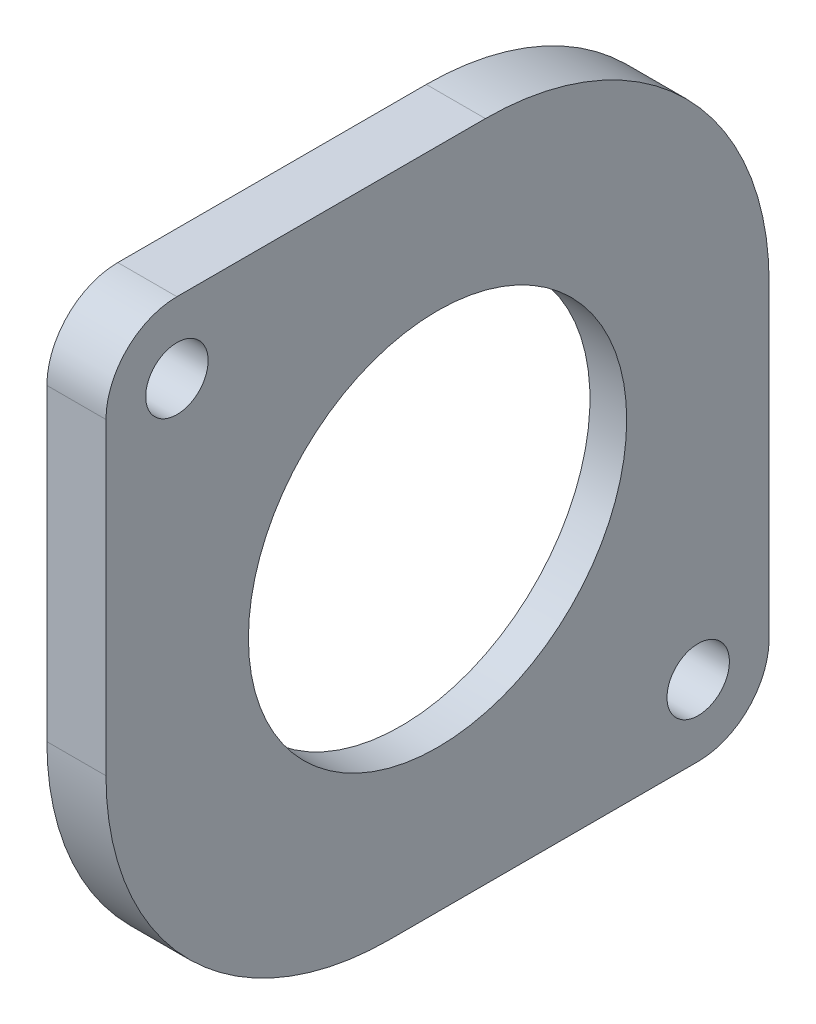
ISO-10303-21;
HEADER;
FILE_DESCRIPTION(('STEP AP214'),'2;1');
FILE_NAME('part.step','',(''),(''),'','','');
FILE_SCHEMA(('AUTOMOTIVE_DESIGN { 1 0 10303 214 1 1 1 1 }'));
ENDSEC;
DATA;
#1=APPLICATION_CONTEXT('core data for automotive mechanical design processes');
#2=APPLICATION_PROTOCOL_DEFINITION('international standard','automotive_design',2000,#1);
#3=PRODUCT_CONTEXT('',#1,'mechanical');
#4=PRODUCT('Part','Part','',(#3));
#5=PRODUCT_RELATED_PRODUCT_CATEGORY('part','',(#4));
#6=PRODUCT_DEFINITION_FORMATION('','',#4);
#7=PRODUCT_DEFINITION_CONTEXT('part definition',#1,'design');
#8=PRODUCT_DEFINITION('design','',#6,#7);
#9=PRODUCT_DEFINITION_SHAPE('','',#8);
#10=(LENGTH_UNIT() NAMED_UNIT(*) SI_UNIT(.MILLI.,.METRE.));
#11=(NAMED_UNIT(*) PLANE_ANGLE_UNIT() SI_UNIT($,.RADIAN.));
#12=(NAMED_UNIT(*) SI_UNIT($,.STERADIAN.) SOLID_ANGLE_UNIT());
#13=UNCERTAINTY_MEASURE_WITH_UNIT(LENGTH_MEASURE(1.E-05),#10,'distance_accuracy_value','');
#14=(GEOMETRIC_REPRESENTATION_CONTEXT(3) GLOBAL_UNCERTAINTY_ASSIGNED_CONTEXT((#13)) GLOBAL_UNIT_ASSIGNED_CONTEXT((#10,
#11,#12)) REPRESENTATION_CONTEXT('',''));
#15=CARTESIAN_POINT('',(0.,0.,0.));
#16=DIRECTION('',(0.,0.,1.));
#17=DIRECTION('',(1.,0.,0.));
#18=AXIS2_PLACEMENT_3D('',#15,#16,#17);
#19=CARTESIAN_POINT('',(3.96875,0.,0.));
#20=DIRECTION('',(-1.,0.,0.));
#21=DIRECTION('',(0.,0.,1.));
#22=AXIS2_PLACEMENT_3D('',#19,#20,#21);
#23=CYLINDRICAL_SURFACE('',#22,12.7);
#24=CARTESIAN_POINT('',(3.96875,0.,0.));
#25=DIRECTION('',(1.,0.,0.));
#26=DIRECTION('',(0.,0.,-1.));
#27=AXIS2_PLACEMENT_3D('',#24,#25,#26);
#28=CIRCLE('',#27,12.7);
#29=CARTESIAN_POINT('',(3.96875,0.,-12.7));
#30=VERTEX_POINT('',#29);
#31=EDGE_CURVE('E147',#30,#30,#28,.T.);
#32=ORIENTED_EDGE('',*,*,#31,.T.);
#33=EDGE_LOOP('',(#32));
#34=FACE_BOUND('',#33,.T.);
#35=CARTESIAN_POINT('',(1.50114,0.,0.));
#36=DIRECTION('',(-1.,0.,0.));
#37=DIRECTION('',(0.,0.,1.));
#38=AXIS2_PLACEMENT_3D('',#35,#36,#37);
#39=CIRCLE('',#38,12.7);
#40=CARTESIAN_POINT('',(1.50114,0.,12.7));
#41=VERTEX_POINT('',#40);
#42=EDGE_CURVE('E178',#41,#41,#39,.T.);
#43=ORIENTED_EDGE('',*,*,#42,.T.);
#44=EDGE_LOOP('',(#43));
#45=FACE_BOUND('',#44,.T.);
#46=ADVANCED_FACE('F39',(#34,#45),#23,.F.);
#47=CARTESIAN_POINT('',(3.96875,-17.5,-17.5));
#48=DIRECTION('',(1.,0.,0.));
#49=DIRECTION('',(0.,0.,-1.));
#50=AXIS2_PLACEMENT_3D('',#47,#48,#49);
#51=PLANE('',#50);
#52=CARTESIAN_POINT('',(3.96875,17.5,17.5));
#53=DIRECTION('',(1.,0.,0.));
#54=DIRECTION('',(0.,0.,-1.));
#55=AXIS2_PLACEMENT_3D('',#52,#53,#54);
#56=CIRCLE('',#55,2.09549999999999);
#57=CARTESIAN_POINT('',(3.96875,17.5,15.4045));
#58=VERTEX_POINT('',#57);
#59=EDGE_CURVE('E265',#58,#58,#56,.T.);
#60=ORIENTED_EDGE('',*,*,#59,.F.);
#61=EDGE_LOOP('',(#60));
#62=FACE_BOUND('',#61,.T.);
#63=CARTESIAN_POINT('',(3.96875,-17.5,-17.5));
#64=DIRECTION('',(1.,0.,0.));
#65=DIRECTION('',(0.,0.,-1.));
#66=AXIS2_PLACEMENT_3D('',#63,#64,#65);
#67=CIRCLE('',#66,2.09549999999999);
#68=CARTESIAN_POINT('',(3.96875,-17.5,-19.5955));
#69=VERTEX_POINT('',#68);
#70=EDGE_CURVE('E264',#69,#69,#67,.T.);
#71=ORIENTED_EDGE('',*,*,#70,.F.);
#72=EDGE_LOOP('',(#71));
#73=FACE_BOUND('',#72,.T.);
#74=CARTESIAN_POINT('',(3.96875,-17.5,-17.5));
#75=DIRECTION('',(1.,0.,0.));
#76=DIRECTION('',(0.,0.,-1.));
#77=AXIS2_PLACEMENT_3D('',#74,#75,#76);
#78=CIRCLE('',#77,4.76250000000001);
#79=CARTESIAN_POINT('',(3.96875,-22.2625,-17.5));
#80=VERTEX_POINT('',#79);
#81=CARTESIAN_POINT('',(3.96875,-17.5,-22.2625));
#82=VERTEX_POINT('',#81);
#83=EDGE_CURVE('E161',#80,#82,#78,.T.);
#84=ORIENTED_EDGE('',*,*,#83,.T.);
#85=DIRECTION('',(0.,1.,0.));
#86=VECTOR('',#85,1.);
#87=CARTESIAN_POINT('',(3.96875,3.21249999999987,-22.2625));
#88=LINE('',#87,#86);
#89=CARTESIAN_POINT('',(3.96875,3.21249999999987,-22.2625));
#90=VERTEX_POINT('',#89);
#91=EDGE_CURVE('E103',#82,#90,#88,.T.);
#92=ORIENTED_EDGE('',*,*,#91,.T.);
#93=CARTESIAN_POINT('',(3.96875,3.2125,-3.21250000000001));
#94=DIRECTION('',(1.,0.,0.));
#95=DIRECTION('',(0.,0.,1.));
#96=AXIS2_PLACEMENT_3D('',#93,#94,#95);
#97=CIRCLE('',#96,19.05);
#98=CARTESIAN_POINT('',(3.96875,22.2625,-3.21249999999987));
#99=VERTEX_POINT('',#98);
#100=EDGE_CURVE('E251',#90,#99,#97,.T.);
#101=ORIENTED_EDGE('',*,*,#100,.T.);
#102=DIRECTION('',(0.,0.,1.));
#103=VECTOR('',#102,1.);
#104=CARTESIAN_POINT('',(3.96875,22.2625,17.5));
#105=LINE('',#104,#103);
#106=CARTESIAN_POINT('',(3.96875,22.2625,17.5));
#107=VERTEX_POINT('',#106);
#108=EDGE_CURVE('E254',#99,#107,#105,.T.);
#109=ORIENTED_EDGE('',*,*,#108,.T.);
#110=CARTESIAN_POINT('',(3.96875,17.5,17.5));
#111=DIRECTION('',(1.,0.,0.));
#112=DIRECTION('',(0.,0.,-1.));
#113=AXIS2_PLACEMENT_3D('',#110,#111,#112);
#114=CIRCLE('',#113,4.7625);
#115=CARTESIAN_POINT('',(3.96875,17.5,22.2625));
#116=VERTEX_POINT('',#115);
#117=EDGE_CURVE('E125',#107,#116,#114,.T.);
#118=ORIENTED_EDGE('',*,*,#117,.T.);
#119=DIRECTION('',(0.,-1.,0.));
#120=VECTOR('',#119,1.);
#121=CARTESIAN_POINT('',(3.96875,17.5,22.2625));
#122=LINE('',#121,#120);
#123=CARTESIAN_POINT('',(3.96875,-3.21249999999986,22.2625));
#124=VERTEX_POINT('',#123);
#125=EDGE_CURVE('E118',#116,#124,#122,.T.);
#126=ORIENTED_EDGE('',*,*,#125,.T.);
#127=CARTESIAN_POINT('',(3.96875,-3.2125,3.2125));
#128=DIRECTION('',(1.,0.,0.));
#129=DIRECTION('',(0.,0.,-1.));
#130=AXIS2_PLACEMENT_3D('',#127,#128,#129);
#131=CIRCLE('',#130,19.05);
#132=CARTESIAN_POINT('',(3.96875,-22.2625,3.21249999999987));
#133=VERTEX_POINT('',#132);
#134=EDGE_CURVE('E123',#124,#133,#131,.T.);
#135=ORIENTED_EDGE('',*,*,#134,.T.);
#136=DIRECTION('',(0.,0.,-1.));
#137=VECTOR('',#136,1.);
#138=CARTESIAN_POINT('',(3.96875,-22.2625,3.21249999999986));
#139=LINE('',#138,#137);
#140=EDGE_CURVE('E57',#133,#80,#139,.T.);
#141=ORIENTED_EDGE('',*,*,#140,.T.);
#142=EDGE_LOOP('',(#84,#92,#101,#109,#118,#126,#135,#141));
#143=FACE_BOUND('',#142,.T.);
#144=ORIENTED_EDGE('',*,*,#31,.F.);
#145=EDGE_LOOP('',(#144));
#146=FACE_BOUND('',#145,.T.);
#147=ADVANCED_FACE('F120',(#62,#73,#143,#146),#51,.T.);
#148=CARTESIAN_POINT('',(0.,-17.5,-17.5));
#149=DIRECTION('',(1.,0.,0.));
#150=DIRECTION('',(0.,0.,-1.));
#151=AXIS2_PLACEMENT_3D('',#148,#149,#150);
#152=PLANE('',#151);
#153=CARTESIAN_POINT('',(0.,0.,0.));
#154=DIRECTION('',(1.,0.,0.));
#155=DIRECTION('',(0.,0.,-1.));
#156=AXIS2_PLACEMENT_3D('',#153,#154,#155);
#157=CIRCLE('',#156,20.394295);
#158=CARTESIAN_POINT('',(0.,0.,-20.394295));
#159=VERTEX_POINT('',#158);
#160=EDGE_CURVE('E11',#159,#159,#157,.T.);
#161=ORIENTED_EDGE('',*,*,#160,.T.);
#162=EDGE_LOOP('',(#161));
#163=FACE_BOUND('',#162,.T.);
#164=CARTESIAN_POINT('',(0.,17.5,17.5));
#165=DIRECTION('',(1.,0.,0.));
#166=DIRECTION('',(0.,0.,-1.));
#167=AXIS2_PLACEMENT_3D('',#164,#165,#166);
#168=CIRCLE('',#167,2.0955);
#169=CARTESIAN_POINT('',(0.,17.5,15.4045));
#170=VERTEX_POINT('',#169);
#171=EDGE_CURVE('E262',#170,#170,#168,.T.);
#172=ORIENTED_EDGE('',*,*,#171,.T.);
#173=EDGE_LOOP('',(#172));
#174=FACE_BOUND('',#173,.T.);
#175=CARTESIAN_POINT('',(0.,-17.5,-17.5));
#176=DIRECTION('',(1.,0.,0.));
#177=DIRECTION('',(0.,0.,-1.));
#178=AXIS2_PLACEMENT_3D('',#175,#176,#177);
#179=CIRCLE('',#178,2.0955);
#180=CARTESIAN_POINT('',(0.,-17.5,-19.5955));
#181=VERTEX_POINT('',#180);
#182=EDGE_CURVE('E270',#181,#181,#179,.T.);
#183=ORIENTED_EDGE('',*,*,#182,.T.);
#184=EDGE_LOOP('',(#183));
#185=FACE_BOUND('',#184,.T.);
#186=CARTESIAN_POINT('',(0.,-17.5,-17.5));
#187=DIRECTION('',(1.,0.,0.));
#188=DIRECTION('',(0.,0.,-1.));
#189=AXIS2_PLACEMENT_3D('',#186,#187,#188);
#190=CIRCLE('',#189,4.76250000000001);
#191=CARTESIAN_POINT('',(0.,-22.2625,-17.5));
#192=VERTEX_POINT('',#191);
#193=CARTESIAN_POINT('',(0.,-17.5,-22.2625));
#194=VERTEX_POINT('',#193);
#195=EDGE_CURVE('E143',#192,#194,#190,.T.);
#196=ORIENTED_EDGE('',*,*,#195,.F.);
#197=DIRECTION('',(0.,0.,-1.));
#198=VECTOR('',#197,1.);
#199=CARTESIAN_POINT('',(0.,-22.2625,3.21249999999986));
#200=LINE('',#199,#198);
#201=CARTESIAN_POINT('',(0.,-22.2625,3.21249999999987));
#202=VERTEX_POINT('',#201);
#203=EDGE_CURVE('E94',#202,#192,#200,.T.);
#204=ORIENTED_EDGE('',*,*,#203,.F.);
#205=CARTESIAN_POINT('',(0.,-3.2125,3.2125));
#206=DIRECTION('',(1.,0.,0.));
#207=DIRECTION('',(0.,0.,-1.));
#208=AXIS2_PLACEMENT_3D('',#205,#206,#207);
#209=CIRCLE('',#208,19.05);
#210=CARTESIAN_POINT('',(0.,-3.21249999999986,22.2625));
#211=VERTEX_POINT('',#210);
#212=EDGE_CURVE('E88',#211,#202,#209,.T.);
#213=ORIENTED_EDGE('',*,*,#212,.F.);
#214=DIRECTION('',(0.,-1.,0.));
#215=VECTOR('',#214,1.);
#216=CARTESIAN_POINT('',(0.,17.5,22.2625));
#217=LINE('',#216,#215);
#218=CARTESIAN_POINT('',(0.,17.5,22.2625));
#219=VERTEX_POINT('',#218);
#220=EDGE_CURVE('E133',#219,#211,#217,.T.);
#221=ORIENTED_EDGE('',*,*,#220,.F.);
#222=CARTESIAN_POINT('',(0.,17.5,17.5));
#223=DIRECTION('',(1.,0.,0.));
#224=DIRECTION('',(0.,0.,-1.));
#225=AXIS2_PLACEMENT_3D('',#222,#223,#224);
#226=CIRCLE('',#225,4.7625);
#227=CARTESIAN_POINT('',(0.,22.2625,17.5));
#228=VERTEX_POINT('',#227);
#229=EDGE_CURVE('E155',#228,#219,#226,.T.);
#230=ORIENTED_EDGE('',*,*,#229,.F.);
#231=DIRECTION('',(0.,0.,1.));
#232=VECTOR('',#231,1.);
#233=CARTESIAN_POINT('',(0.,22.2625,17.5));
#234=LINE('',#233,#232);
#235=CARTESIAN_POINT('',(0.,22.2625,-3.21249999999987));
#236=VERTEX_POINT('',#235);
#237=EDGE_CURVE('E152',#236,#228,#234,.T.);
#238=ORIENTED_EDGE('',*,*,#237,.F.);
#239=CARTESIAN_POINT('',(0.,3.2125,-3.21250000000001));
#240=DIRECTION('',(1.,0.,0.));
#241=DIRECTION('',(0.,0.,1.));
#242=AXIS2_PLACEMENT_3D('',#239,#240,#241);
#243=CIRCLE('',#242,19.05);
#244=CARTESIAN_POINT('',(0.,3.21249999999987,-22.2625));
#245=VERTEX_POINT('',#244);
#246=EDGE_CURVE('E149',#245,#236,#243,.T.);
#247=ORIENTED_EDGE('',*,*,#246,.F.);
#248=DIRECTION('',(0.,1.,0.));
#249=VECTOR('',#248,1.);
#250=CARTESIAN_POINT('',(0.,3.21249999999987,-22.2625));
#251=LINE('',#250,#249);
#252=EDGE_CURVE('E146',#194,#245,#251,.T.);
#253=ORIENTED_EDGE('',*,*,#252,.F.);
#254=EDGE_LOOP('',(#196,#204,#213,#221,#230,#238,#247,#253));
#255=FACE_BOUND('',#254,.T.);
#256=ADVANCED_FACE('F206',(#163,#174,#185,#255),#152,.F.);
#257=CARTESIAN_POINT('',(3.96875,-17.5,-17.5));
#258=DIRECTION('',(-1.,0.,0.));
#259=DIRECTION('',(0.,0.,1.));
#260=AXIS2_PLACEMENT_3D('',#257,#258,#259);
#261=CYLINDRICAL_SURFACE('',#260,4.76250000000001);
#262=ORIENTED_EDGE('',*,*,#195,.T.);
#263=DIRECTION('',(-1.,0.,0.));
#264=VECTOR('',#263,1.);
#265=CARTESIAN_POINT('',(3.96875,-17.5,-22.2625));
#266=LINE('',#265,#264);
#267=EDGE_CURVE('E176',#82,#194,#266,.T.);
#268=ORIENTED_EDGE('',*,*,#267,.F.);
#269=ORIENTED_EDGE('',*,*,#83,.F.);
#270=DIRECTION('',(-1.,0.,0.));
#271=VECTOR('',#270,1.);
#272=CARTESIAN_POINT('',(3.96875,-22.2625,-17.5));
#273=LINE('',#272,#271);
#274=EDGE_CURVE('E139',#80,#192,#273,.T.);
#275=ORIENTED_EDGE('',*,*,#274,.T.);
#276=EDGE_LOOP('',(#262,#268,#269,#275));
#277=FACE_BOUND('',#276,.T.);
#278=ADVANCED_FACE('F216',(#277),#261,.T.);
#279=CARTESIAN_POINT('',(3.96875,3.21249999999987,-22.2625));
#280=DIRECTION('',(0.,0.,1.));
#281=DIRECTION('',(0.,-1.,0.));
#282=AXIS2_PLACEMENT_3D('',#279,#280,#281);
#283=PLANE('',#282);
#284=ORIENTED_EDGE('',*,*,#252,.T.);
#285=DIRECTION('',(-1.,0.,0.));
#286=VECTOR('',#285,1.);
#287=CARTESIAN_POINT('',(3.96875,3.21249999999987,-22.2625));
#288=LINE('',#287,#286);
#289=EDGE_CURVE('E173',#90,#245,#288,.T.);
#290=ORIENTED_EDGE('',*,*,#289,.F.);
#291=ORIENTED_EDGE('',*,*,#91,.F.);
#292=ORIENTED_EDGE('',*,*,#267,.T.);
#293=EDGE_LOOP('',(#284,#290,#291,#292));
#294=FACE_BOUND('',#293,.T.);
#295=ADVANCED_FACE('F236',(#294),#283,.F.);
#296=CARTESIAN_POINT('',(3.96875,3.2125,-3.21250000000001));
#297=DIRECTION('',(-1.,0.,0.));
#298=DIRECTION('',(0.,0.,1.));
#299=AXIS2_PLACEMENT_3D('',#296,#297,#298);
#300=CYLINDRICAL_SURFACE('',#299,19.05);
#301=ORIENTED_EDGE('',*,*,#246,.T.);
#302=DIRECTION('',(-1.,0.,0.));
#303=VECTOR('',#302,1.);
#304=CARTESIAN_POINT('',(3.96875,22.2625,-3.21249999999987));
#305=LINE('',#304,#303);
#306=EDGE_CURVE('E169',#99,#236,#305,.T.);
#307=ORIENTED_EDGE('',*,*,#306,.F.);
#308=ORIENTED_EDGE('',*,*,#100,.F.);
#309=ORIENTED_EDGE('',*,*,#289,.T.);
#310=EDGE_LOOP('',(#301,#307,#308,#309));
#311=FACE_BOUND('',#310,.T.);
#312=ADVANCED_FACE('F232',(#311),#300,.T.);
#313=CARTESIAN_POINT('',(3.96875,22.2625,17.5));
#314=DIRECTION('',(0.,-1.,0.));
#315=DIRECTION('',(0.,0.,-1.));
#316=AXIS2_PLACEMENT_3D('',#313,#314,#315);
#317=PLANE('',#316);
#318=ORIENTED_EDGE('',*,*,#237,.T.);
#319=DIRECTION('',(-1.,0.,0.));
#320=VECTOR('',#319,1.);
#321=CARTESIAN_POINT('',(3.96875,22.2625,17.5));
#322=LINE('',#321,#320);
#323=EDGE_CURVE('E165',#107,#228,#322,.T.);
#324=ORIENTED_EDGE('',*,*,#323,.F.);
#325=ORIENTED_EDGE('',*,*,#108,.F.);
#326=ORIENTED_EDGE('',*,*,#306,.T.);
#327=EDGE_LOOP('',(#318,#324,#325,#326));
#328=FACE_BOUND('',#327,.T.);
#329=ADVANCED_FACE('F228',(#328),#317,.F.);
#330=CARTESIAN_POINT('',(3.96875,17.5,17.5));
#331=DIRECTION('',(-1.,0.,0.));
#332=DIRECTION('',(0.,0.,1.));
#333=AXIS2_PLACEMENT_3D('',#330,#331,#332);
#334=CYLINDRICAL_SURFACE('',#333,4.7625);
#335=ORIENTED_EDGE('',*,*,#229,.T.);
#336=DIRECTION('',(-1.,0.,0.));
#337=VECTOR('',#336,1.);
#338=CARTESIAN_POINT('',(3.96875,17.5,22.2625));
#339=LINE('',#338,#337);
#340=EDGE_CURVE('E134',#116,#219,#339,.T.);
#341=ORIENTED_EDGE('',*,*,#340,.F.);
#342=ORIENTED_EDGE('',*,*,#117,.F.);
#343=ORIENTED_EDGE('',*,*,#323,.T.);
#344=EDGE_LOOP('',(#335,#341,#342,#343));
#345=FACE_BOUND('',#344,.T.);
#346=ADVANCED_FACE('F225',(#345),#334,.T.);
#347=CARTESIAN_POINT('',(3.96875,17.5,22.2625));
#348=DIRECTION('',(0.,0.,-1.));
#349=DIRECTION('',(0.,1.,0.));
#350=AXIS2_PLACEMENT_3D('',#347,#348,#349);
#351=PLANE('',#350);
#352=ORIENTED_EDGE('',*,*,#220,.T.);
#353=DIRECTION('',(-1.,0.,0.));
#354=VECTOR('',#353,1.);
#355=CARTESIAN_POINT('',(3.96875,-3.21249999999986,22.2625));
#356=LINE('',#355,#354);
#357=EDGE_CURVE('E130',#124,#211,#356,.T.);
#358=ORIENTED_EDGE('',*,*,#357,.F.);
#359=ORIENTED_EDGE('',*,*,#125,.F.);
#360=ORIENTED_EDGE('',*,*,#340,.T.);
#361=EDGE_LOOP('',(#352,#358,#359,#360));
#362=FACE_BOUND('',#361,.T.);
#363=ADVANCED_FACE('F131',(#362),#351,.F.);
#364=CARTESIAN_POINT('',(3.96875,-3.2125,3.2125));
#365=DIRECTION('',(-1.,0.,0.));
#366=DIRECTION('',(0.,0.,1.));
#367=AXIS2_PLACEMENT_3D('',#364,#365,#366);
#368=CYLINDRICAL_SURFACE('',#367,19.05);
#369=ORIENTED_EDGE('',*,*,#212,.T.);
#370=DIRECTION('',(-1.,0.,0.));
#371=VECTOR('',#370,1.);
#372=CARTESIAN_POINT('',(3.96875,-22.2625,3.21249999999987));
#373=LINE('',#372,#371);
#374=EDGE_CURVE('E135',#133,#202,#373,.T.);
#375=ORIENTED_EDGE('',*,*,#374,.F.);
#376=ORIENTED_EDGE('',*,*,#134,.F.);
#377=ORIENTED_EDGE('',*,*,#357,.T.);
#378=EDGE_LOOP('',(#369,#375,#376,#377));
#379=FACE_BOUND('',#378,.T.);
#380=ADVANCED_FACE('F137',(#379),#368,.T.);
#381=CARTESIAN_POINT('',(3.96875,-22.2625,3.21249999999986));
#382=DIRECTION('',(0.,1.,0.));
#383=DIRECTION('',(0.,0.,1.));
#384=AXIS2_PLACEMENT_3D('',#381,#382,#383);
#385=PLANE('',#384);
#386=ORIENTED_EDGE('',*,*,#203,.T.);
#387=ORIENTED_EDGE('',*,*,#274,.F.);
#388=ORIENTED_EDGE('',*,*,#140,.F.);
#389=ORIENTED_EDGE('',*,*,#374,.T.);
#390=EDGE_LOOP('',(#386,#387,#388,#389));
#391=FACE_BOUND('',#390,.T.);
#392=ADVANCED_FACE('F218',(#391),#385,.F.);
#393=CARTESIAN_POINT('',(1.50114,0.,0.));
#394=DIRECTION('',(-1.,0.,0.));
#395=DIRECTION('',(0.,0.,1.));
#396=AXIS2_PLACEMENT_3D('',#393,#394,#395);
#397=CYLINDRICAL_SURFACE('',#396,19.99742);
#398=CARTESIAN_POINT('',(0.396875,0.,0.));
#399=DIRECTION('',(1.,0.,0.));
#400=DIRECTION('',(0.,0.,-1.));
#401=AXIS2_PLACEMENT_3D('',#398,#399,#400);
#402=CIRCLE('',#401,19.99742);
#403=CARTESIAN_POINT('',(0.396875,0.,-19.99742));
#404=VERTEX_POINT('',#403);
#405=EDGE_CURVE('E49',#404,#404,#402,.F.);
#406=ORIENTED_EDGE('',*,*,#405,.T.);
#407=EDGE_LOOP('',(#406));
#408=FACE_BOUND('',#407,.T.);
#409=CARTESIAN_POINT('',(1.50114,0.,0.));
#410=DIRECTION('',(-1.,0.,0.));
#411=DIRECTION('',(0.,0.,1.));
#412=AXIS2_PLACEMENT_3D('',#409,#410,#411);
#413=CIRCLE('',#412,19.99742);
#414=CARTESIAN_POINT('',(1.50114,0.,19.99742));
#415=VERTEX_POINT('',#414);
#416=EDGE_CURVE('E181',#415,#415,#413,.T.);
#417=ORIENTED_EDGE('',*,*,#416,.F.);
#418=EDGE_LOOP('',(#417));
#419=FACE_BOUND('',#418,.T.);
#420=ADVANCED_FACE('F187',(#408,#419),#397,.F.);
#421=CARTESIAN_POINT('',(1.50114,0.,0.));
#422=DIRECTION('',(-1.,0.,0.));
#423=DIRECTION('',(0.,0.,1.));
#424=AXIS2_PLACEMENT_3D('',#421,#422,#423);
#425=PLANE('',#424);
#426=ORIENTED_EDGE('',*,*,#42,.F.);
#427=EDGE_LOOP('',(#426));
#428=FACE_BOUND('',#427,.T.);
#429=ORIENTED_EDGE('',*,*,#416,.T.);
#430=EDGE_LOOP('',(#429));
#431=FACE_BOUND('',#430,.T.);
#432=ADVANCED_FACE('F283',(#428,#431),#425,.T.);
#433=CARTESIAN_POINT('',(3.96875,-17.5,-17.5));
#434=DIRECTION('',(1.,0.,0.));
#435=DIRECTION('',(0.,0.,-1.));
#436=AXIS2_PLACEMENT_3D('',#433,#434,#435);
#437=CYLINDRICAL_SURFACE('',#436,2.09549999999999);
#438=ORIENTED_EDGE('',*,*,#182,.F.);
#439=EDGE_LOOP('',(#438));
#440=FACE_BOUND('',#439,.T.);
#441=ORIENTED_EDGE('',*,*,#70,.T.);
#442=EDGE_LOOP('',(#441));
#443=FACE_BOUND('',#442,.T.);
#444=ADVANCED_FACE('F196',(#440,#443),#437,.F.);
#445=CARTESIAN_POINT('',(3.96875,17.5,17.5));
#446=DIRECTION('',(1.,0.,0.));
#447=DIRECTION('',(0.,0.,-1.));
#448=AXIS2_PLACEMENT_3D('',#445,#446,#447);
#449=CYLINDRICAL_SURFACE('',#448,2.09549999999999);
#450=ORIENTED_EDGE('',*,*,#171,.F.);
#451=EDGE_LOOP('',(#450));
#452=FACE_BOUND('',#451,.T.);
#453=ORIENTED_EDGE('',*,*,#59,.T.);
#454=EDGE_LOOP('',(#453));
#455=FACE_BOUND('',#454,.T.);
#456=ADVANCED_FACE('F191',(#452,#455),#449,.F.);
#457=CARTESIAN_POINT('',(0.396875,0.,0.));
#458=DIRECTION('',(1.,0.,0.));
#459=DIRECTION('',(0.,0.,-1.));
#460=AXIS2_PLACEMENT_3D('',#457,#458,#459);
#461=TOROIDAL_SURFACE('',#460,20.394295,0.396875);
#462=ORIENTED_EDGE('',*,*,#160,.F.);
#463=EDGE_LOOP('',(#462));
#464=FACE_BOUND('',#463,.T.);
#465=ORIENTED_EDGE('',*,*,#405,.F.);
#466=EDGE_LOOP('',(#465));
#467=FACE_BOUND('',#466,.T.);
#468=ADVANCED_FACE('F41',(#464,#467),#461,.T.);
#469=CLOSED_SHELL('',(#46,#147,#256,#278,#295,#312,#329,#346,#363,#380,#392,#420,#432,#444,#456,#468));
#470=MANIFOLD_SOLID_BREP('B2',#469);
#471=ADVANCED_BREP_SHAPE_REPRESENTATION('',(#18,#470),#14);
#472=SHAPE_DEFINITION_REPRESENTATION(#9,#471);
ENDSEC;
END-ISO-10303-21;
